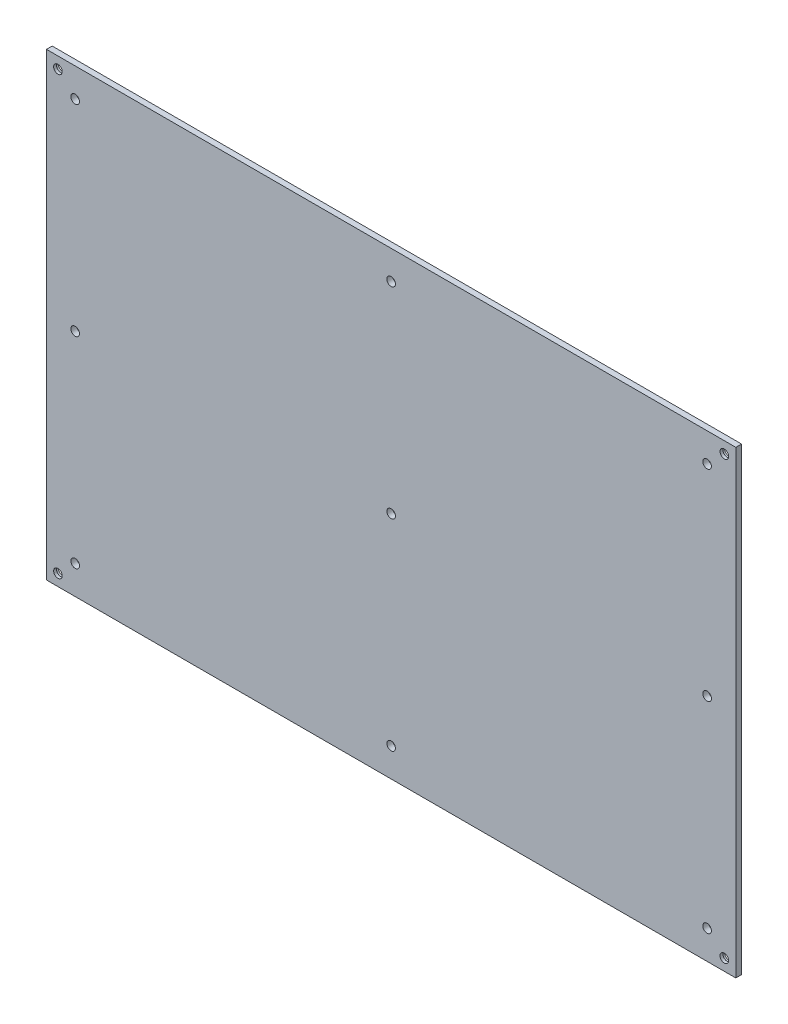
ISO-10303-21;
HEADER;
FILE_DESCRIPTION(('STEP AP214'),'2;1');
FILE_NAME('part.step','',(''),(''),'','','');
FILE_SCHEMA(('AUTOMOTIVE_DESIGN { 1 0 10303 214 1 1 1 1 }'));
ENDSEC;
DATA;
#1=APPLICATION_CONTEXT('core data for automotive mechanical design processes');
#2=APPLICATION_PROTOCOL_DEFINITION('international standard','automotive_design',2000,#1);
#3=PRODUCT_CONTEXT('',#1,'mechanical');
#4=PRODUCT('Part','Part','',(#3));
#5=PRODUCT_RELATED_PRODUCT_CATEGORY('part','',(#4));
#6=PRODUCT_DEFINITION_FORMATION('','',#4);
#7=PRODUCT_DEFINITION_CONTEXT('part definition',#1,'design');
#8=PRODUCT_DEFINITION('design','',#6,#7);
#9=PRODUCT_DEFINITION_SHAPE('','',#8);
#10=(LENGTH_UNIT() NAMED_UNIT(*) SI_UNIT(.MILLI.,.METRE.));
#11=(NAMED_UNIT(*) PLANE_ANGLE_UNIT() SI_UNIT($,.RADIAN.));
#12=(NAMED_UNIT(*) SI_UNIT($,.STERADIAN.) SOLID_ANGLE_UNIT());
#13=UNCERTAINTY_MEASURE_WITH_UNIT(LENGTH_MEASURE(1.E-05),#10,'distance_accuracy_value','');
#14=(GEOMETRIC_REPRESENTATION_CONTEXT(3) GLOBAL_UNCERTAINTY_ASSIGNED_CONTEXT((#13)) GLOBAL_UNIT_ASSIGNED_CONTEXT((#10,
#11,#12)) REPRESENTATION_CONTEXT('',''));
#15=CARTESIAN_POINT('',(0.,0.,0.));
#16=DIRECTION('',(0.,0.,1.));
#17=DIRECTION('',(1.,0.,0.));
#18=AXIS2_PLACEMENT_3D('',#15,#16,#17);
#19=CARTESIAN_POINT('',(120.,80.,2.));
#20=DIRECTION('',(-1.,0.,0.));
#21=DIRECTION('',(0.,0.,1.));
#22=AXIS2_PLACEMENT_3D('',#19,#20,#21);
#23=PLANE('',#22);
#24=DIRECTION('',(0.,1.,0.));
#25=VECTOR('',#24,1.);
#26=CARTESIAN_POINT('',(120.,80.,0.));
#27=LINE('',#26,#25);
#28=CARTESIAN_POINT('',(120.,-80.,0.));
#29=VERTEX_POINT('',#28);
#30=CARTESIAN_POINT('',(120.,80.,0.));
#31=VERTEX_POINT('',#30);
#32=EDGE_CURVE('E105',#29,#31,#27,.T.);
#33=ORIENTED_EDGE('',*,*,#32,.T.);
#34=DIRECTION('',(0.,0.,-1.));
#35=VECTOR('',#34,1.);
#36=CARTESIAN_POINT('',(120.,80.,2.));
#37=LINE('',#36,#35);
#38=CARTESIAN_POINT('',(120.,80.,2.));
#39=VERTEX_POINT('',#38);
#40=EDGE_CURVE('E11',#39,#31,#37,.T.);
#41=ORIENTED_EDGE('',*,*,#40,.F.);
#42=DIRECTION('',(0.,1.,0.));
#43=VECTOR('',#42,1.);
#44=CARTESIAN_POINT('',(120.,80.,2.));
#45=LINE('',#44,#43);
#46=CARTESIAN_POINT('',(120.,-80.,2.));
#47=VERTEX_POINT('',#46);
#48=EDGE_CURVE('E92',#47,#39,#45,.T.);
#49=ORIENTED_EDGE('',*,*,#48,.F.);
#50=DIRECTION('',(0.,0.,-1.));
#51=VECTOR('',#50,1.);
#52=CARTESIAN_POINT('',(120.,-80.,2.));
#53=LINE('',#52,#51);
#54=EDGE_CURVE('E101',#47,#29,#53,.T.);
#55=ORIENTED_EDGE('',*,*,#54,.T.);
#56=EDGE_LOOP('',(#33,#41,#49,#55));
#57=FACE_BOUND('',#56,.T.);
#58=ADVANCED_FACE('F39',(#57),#23,.F.);
#59=CARTESIAN_POINT('',(-120.,80.,2.));
#60=DIRECTION('',(0.,-1.,0.));
#61=DIRECTION('',(0.,0.,-1.));
#62=AXIS2_PLACEMENT_3D('',#59,#60,#61);
#63=PLANE('',#62);
#64=DIRECTION('',(-1.,0.,0.));
#65=VECTOR('',#64,1.);
#66=CARTESIAN_POINT('',(-120.,80.,0.));
#67=LINE('',#66,#65);
#68=CARTESIAN_POINT('',(-120.,80.,0.));
#69=VERTEX_POINT('',#68);
#70=EDGE_CURVE('E96',#31,#69,#67,.T.);
#71=ORIENTED_EDGE('',*,*,#70,.T.);
#72=DIRECTION('',(0.,0.,-1.));
#73=VECTOR('',#72,1.);
#74=CARTESIAN_POINT('',(-120.,80.,2.));
#75=LINE('',#74,#73);
#76=CARTESIAN_POINT('',(-120.,80.,2.));
#77=VERTEX_POINT('',#76);
#78=EDGE_CURVE('E48',#77,#69,#75,.T.);
#79=ORIENTED_EDGE('',*,*,#78,.F.);
#80=DIRECTION('',(-1.,0.,0.));
#81=VECTOR('',#80,1.);
#82=CARTESIAN_POINT('',(-120.,80.,2.));
#83=LINE('',#82,#81);
#84=EDGE_CURVE('E87',#39,#77,#83,.T.);
#85=ORIENTED_EDGE('',*,*,#84,.F.);
#86=ORIENTED_EDGE('',*,*,#40,.T.);
#87=EDGE_LOOP('',(#71,#79,#85,#86));
#88=FACE_BOUND('',#87,.T.);
#89=ADVANCED_FACE('F95',(#88),#63,.F.);
#90=CARTESIAN_POINT('',(-120.,80.,2.));
#91=DIRECTION('',(1.,0.,0.));
#92=DIRECTION('',(0.,1.,0.));
#93=AXIS2_PLACEMENT_3D('',#90,#91,#92);
#94=PLANE('',#93);
#95=DIRECTION('',(0.,-1.,0.));
#96=VECTOR('',#95,1.);
#97=CARTESIAN_POINT('',(-120.,80.,0.));
#98=LINE('',#97,#96);
#99=CARTESIAN_POINT('',(-120.,-80.,0.));
#100=VERTEX_POINT('',#99);
#101=EDGE_CURVE('E74',#69,#100,#98,.T.);
#102=ORIENTED_EDGE('',*,*,#101,.T.);
#103=DIRECTION('',(0.,0.,-1.));
#104=VECTOR('',#103,1.);
#105=CARTESIAN_POINT('',(-120.,-80.,2.));
#106=LINE('',#105,#104);
#107=CARTESIAN_POINT('',(-120.,-80.,2.));
#108=VERTEX_POINT('',#107);
#109=EDGE_CURVE('E97',#108,#100,#106,.T.);
#110=ORIENTED_EDGE('',*,*,#109,.F.);
#111=DIRECTION('',(0.,-1.,0.));
#112=VECTOR('',#111,1.);
#113=CARTESIAN_POINT('',(-120.,80.,2.));
#114=LINE('',#113,#112);
#115=EDGE_CURVE('E90',#77,#108,#114,.T.);
#116=ORIENTED_EDGE('',*,*,#115,.F.);
#117=ORIENTED_EDGE('',*,*,#78,.T.);
#118=EDGE_LOOP('',(#102,#110,#116,#117));
#119=FACE_BOUND('',#118,.T.);
#120=ADVANCED_FACE('F99',(#119),#94,.F.);
#121=CARTESIAN_POINT('',(-120.,-80.,2.));
#122=DIRECTION('',(0.,1.,0.));
#123=DIRECTION('',(0.,0.,1.));
#124=AXIS2_PLACEMENT_3D('',#121,#122,#123);
#125=PLANE('',#124);
#126=DIRECTION('',(1.,0.,0.));
#127=VECTOR('',#126,1.);
#128=CARTESIAN_POINT('',(-120.,-80.,0.));
#129=LINE('',#128,#127);
#130=EDGE_CURVE('E80',#100,#29,#129,.T.);
#131=ORIENTED_EDGE('',*,*,#130,.T.);
#132=ORIENTED_EDGE('',*,*,#54,.F.);
#133=DIRECTION('',(1.,0.,0.));
#134=VECTOR('',#133,1.);
#135=CARTESIAN_POINT('',(-120.,-80.,2.));
#136=LINE('',#135,#134);
#137=EDGE_CURVE('E57',#108,#47,#136,.T.);
#138=ORIENTED_EDGE('',*,*,#137,.F.);
#139=ORIENTED_EDGE('',*,*,#109,.T.);
#140=EDGE_LOOP('',(#131,#132,#138,#139));
#141=FACE_BOUND('',#140,.T.);
#142=ADVANCED_FACE('F179',(#141),#125,.F.);
#143=CARTESIAN_POINT('',(0.,0.,2.));
#144=DIRECTION('',(0.,0.,1.));
#145=DIRECTION('',(1.,0.,0.));
#146=AXIS2_PLACEMENT_3D('',#143,#144,#145);
#147=PLANE('',#146);
#148=CARTESIAN_POINT('',(116.,-76.,2.));
#149=DIRECTION('',(0.,0.,-1.));
#150=DIRECTION('',(1.,0.,0.));
#151=AXIS2_PLACEMENT_3D('',#148,#149,#150);
#152=CIRCLE('',#151,1.5);
#153=CARTESIAN_POINT('',(117.5,-76.,2.));
#154=VERTEX_POINT('',#153);
#155=EDGE_CURVE('E385',#154,#154,#152,.T.);
#156=ORIENTED_EDGE('',*,*,#155,.T.);
#157=EDGE_LOOP('',(#156));
#158=FACE_BOUND('',#157,.T.);
#159=CARTESIAN_POINT('',(116.,76.,2.));
#160=DIRECTION('',(0.,0.,-1.));
#161=DIRECTION('',(-1.,0.,0.));
#162=AXIS2_PLACEMENT_3D('',#159,#160,#161);
#163=CIRCLE('',#162,1.5);
#164=CARTESIAN_POINT('',(114.5,76.,2.));
#165=VERTEX_POINT('',#164);
#166=EDGE_CURVE('E389',#165,#165,#163,.T.);
#167=ORIENTED_EDGE('',*,*,#166,.T.);
#168=EDGE_LOOP('',(#167));
#169=FACE_BOUND('',#168,.T.);
#170=CARTESIAN_POINT('',(-116.,76.,2.));
#171=DIRECTION('',(0.,0.,-1.));
#172=DIRECTION('',(1.,0.,0.));
#173=AXIS2_PLACEMENT_3D('',#170,#171,#172);
#174=CIRCLE('',#173,1.5);
#175=CARTESIAN_POINT('',(-114.5,76.,2.));
#176=VERTEX_POINT('',#175);
#177=EDGE_CURVE('E512',#176,#176,#174,.T.);
#178=ORIENTED_EDGE('',*,*,#177,.T.);
#179=EDGE_LOOP('',(#178));
#180=FACE_BOUND('',#179,.T.);
#181=CARTESIAN_POINT('',(-116.,-76.,2.));
#182=DIRECTION('',(0.,0.,-1.));
#183=DIRECTION('',(-1.,0.,0.));
#184=AXIS2_PLACEMENT_3D('',#181,#182,#183);
#185=CIRCLE('',#184,1.5);
#186=CARTESIAN_POINT('',(-117.5,-76.,2.));
#187=VERTEX_POINT('',#186);
#188=EDGE_CURVE('E397',#187,#187,#185,.T.);
#189=ORIENTED_EDGE('',*,*,#188,.T.);
#190=EDGE_LOOP('',(#189));
#191=FACE_BOUND('',#190,.T.);
#192=CARTESIAN_POINT('',(0.,70.,2.));
#193=DIRECTION('',(0.,0.,1.));
#194=DIRECTION('',(1.,0.,0.));
#195=AXIS2_PLACEMENT_3D('',#192,#193,#194);
#196=CIRCLE('',#195,1.5);
#197=CARTESIAN_POINT('',(1.50000000000001,70.,2.));
#198=VERTEX_POINT('',#197);
#199=EDGE_CURVE('E441',#198,#198,#196,.T.);
#200=ORIENTED_EDGE('',*,*,#199,.F.);
#201=EDGE_LOOP('',(#200));
#202=FACE_BOUND('',#201,.T.);
#203=CARTESIAN_POINT('',(110.,70.,2.));
#204=DIRECTION('',(0.,0.,1.));
#205=DIRECTION('',(1.,0.,0.));
#206=AXIS2_PLACEMENT_3D('',#203,#204,#205);
#207=CIRCLE('',#206,1.5);
#208=CARTESIAN_POINT('',(111.5,70.,2.));
#209=VERTEX_POINT('',#208);
#210=EDGE_CURVE('E443',#209,#209,#207,.T.);
#211=ORIENTED_EDGE('',*,*,#210,.F.);
#212=EDGE_LOOP('',(#211));
#213=FACE_BOUND('',#212,.T.);
#214=CARTESIAN_POINT('',(7.49400541621981E-13,0.,2.));
#215=DIRECTION('',(0.,0.,1.));
#216=DIRECTION('',(1.,0.,0.));
#217=AXIS2_PLACEMENT_3D('',#214,#215,#216);
#218=CIRCLE('',#217,1.5);
#219=CARTESIAN_POINT('',(1.50000000000075,0.,2.));
#220=VERTEX_POINT('',#219);
#221=EDGE_CURVE('E446',#220,#220,#218,.T.);
#222=ORIENTED_EDGE('',*,*,#221,.F.);
#223=EDGE_LOOP('',(#222));
#224=FACE_BOUND('',#223,.T.);
#225=CARTESIAN_POINT('',(110.000000000001,0.,2.));
#226=DIRECTION('',(0.,0.,1.));
#227=DIRECTION('',(1.,0.,0.));
#228=AXIS2_PLACEMENT_3D('',#225,#226,#227);
#229=CIRCLE('',#228,1.5);
#230=CARTESIAN_POINT('',(111.500000000001,0.,2.));
#231=VERTEX_POINT('',#230);
#232=EDGE_CURVE('E432',#231,#231,#229,.T.);
#233=ORIENTED_EDGE('',*,*,#232,.F.);
#234=EDGE_LOOP('',(#233));
#235=FACE_BOUND('',#234,.T.);
#236=CARTESIAN_POINT('',(1.47104550762833E-12,-70.,2.));
#237=DIRECTION('',(0.,0.,1.));
#238=DIRECTION('',(1.,0.,0.));
#239=AXIS2_PLACEMENT_3D('',#236,#237,#238);
#240=CIRCLE('',#239,1.5);
#241=CARTESIAN_POINT('',(1.50000000000147,-70.,2.));
#242=VERTEX_POINT('',#241);
#243=EDGE_CURVE('E429',#242,#242,#240,.T.);
#244=ORIENTED_EDGE('',*,*,#243,.F.);
#245=EDGE_LOOP('',(#244));
#246=FACE_BOUND('',#245,.T.);
#247=CARTESIAN_POINT('',(110.000000000001,-70.,2.));
#248=DIRECTION('',(0.,0.,1.));
#249=DIRECTION('',(1.,0.,0.));
#250=AXIS2_PLACEMENT_3D('',#247,#248,#249);
#251=CIRCLE('',#250,1.5);
#252=CARTESIAN_POINT('',(111.500000000001,-70.,2.));
#253=VERTEX_POINT('',#252);
#254=EDGE_CURVE('E433',#253,#253,#251,.T.);
#255=ORIENTED_EDGE('',*,*,#254,.F.);
#256=EDGE_LOOP('',(#255));
#257=FACE_BOUND('',#256,.T.);
#258=CARTESIAN_POINT('',(-109.999999999999,0.,2.));
#259=DIRECTION('',(0.,0.,1.));
#260=DIRECTION('',(1.,0.,0.));
#261=AXIS2_PLACEMENT_3D('',#258,#259,#260);
#262=CIRCLE('',#261,1.5);
#263=CARTESIAN_POINT('',(-108.499999999999,0.,2.));
#264=VERTEX_POINT('',#263);
#265=EDGE_CURVE('E436',#264,#264,#262,.T.);
#266=ORIENTED_EDGE('',*,*,#265,.F.);
#267=EDGE_LOOP('',(#266));
#268=FACE_BOUND('',#267,.T.);
#269=CARTESIAN_POINT('',(-109.999999999999,-70.,2.));
#270=DIRECTION('',(0.,0.,1.));
#271=DIRECTION('',(1.,0.,0.));
#272=AXIS2_PLACEMENT_3D('',#269,#270,#271);
#273=CIRCLE('',#272,1.5);
#274=CARTESIAN_POINT('',(-108.499999999999,-70.,2.));
#275=VERTEX_POINT('',#274);
#276=EDGE_CURVE('E426',#275,#275,#273,.T.);
#277=ORIENTED_EDGE('',*,*,#276,.F.);
#278=EDGE_LOOP('',(#277));
#279=FACE_BOUND('',#278,.T.);
#280=CARTESIAN_POINT('',(-110.,70.,2.));
#281=DIRECTION('',(0.,0.,1.));
#282=DIRECTION('',(1.,0.,0.));
#283=AXIS2_PLACEMENT_3D('',#280,#281,#282);
#284=CIRCLE('',#283,1.5);
#285=CARTESIAN_POINT('',(-108.5,70.,2.));
#286=VERTEX_POINT('',#285);
#287=EDGE_CURVE('E117',#286,#286,#284,.T.);
#288=ORIENTED_EDGE('',*,*,#287,.F.);
#289=EDGE_LOOP('',(#288));
#290=FACE_BOUND('',#289,.T.);
#291=ORIENTED_EDGE('',*,*,#48,.T.);
#292=ORIENTED_EDGE('',*,*,#84,.T.);
#293=ORIENTED_EDGE('',*,*,#115,.T.);
#294=ORIENTED_EDGE('',*,*,#137,.T.);
#295=EDGE_LOOP('',(#291,#292,#293,#294));
#296=FACE_BOUND('',#295,.T.);
#297=ADVANCED_FACE('F88',(#158,#169,#180,#191,#202,#213,#224,#235,#246,#257,#268,#279,#290,
#296),#147,.T.);
#298=CARTESIAN_POINT('',(0.,0.,0.));
#299=DIRECTION('',(0.,0.,1.));
#300=DIRECTION('',(1.,0.,0.));
#301=AXIS2_PLACEMENT_3D('',#298,#299,#300);
#302=PLANE('',#301);
#303=CARTESIAN_POINT('',(116.000000000002,-75.9999999999999,0.));
#304=DIRECTION('',(0.,0.,-1.));
#305=DIRECTION('',(1.,0.,0.));
#306=AXIS2_PLACEMENT_3D('',#303,#304,#305);
#307=CIRCLE('',#306,2.);
#308=CARTESIAN_POINT('',(118.000000000002,-75.9999999999999,0.));
#309=VERTEX_POINT('',#308);
#310=EDGE_CURVE('E418',#309,#309,#307,.T.);
#311=ORIENTED_EDGE('',*,*,#310,.F.);
#312=EDGE_LOOP('',(#311));
#313=FACE_BOUND('',#312,.T.);
#314=CARTESIAN_POINT('',(116.000000000001,75.9999999999999,0.));
#315=DIRECTION('',(0.,0.,-1.));
#316=DIRECTION('',(-1.,0.,0.));
#317=AXIS2_PLACEMENT_3D('',#314,#315,#316);
#318=CIRCLE('',#317,2.);
#319=CARTESIAN_POINT('',(114.000000000001,75.9999999999999,0.));
#320=VERTEX_POINT('',#319);
#321=EDGE_CURVE('E412',#320,#320,#318,.T.);
#322=ORIENTED_EDGE('',*,*,#321,.F.);
#323=EDGE_LOOP('',(#322));
#324=FACE_BOUND('',#323,.T.);
#325=CARTESIAN_POINT('',(-116.,76.,0.));
#326=DIRECTION('',(0.,0.,-1.));
#327=DIRECTION('',(1.,0.,0.));
#328=AXIS2_PLACEMENT_3D('',#325,#326,#327);
#329=CIRCLE('',#328,2.);
#330=CARTESIAN_POINT('',(-114.,76.,0.));
#331=VERTEX_POINT('',#330);
#332=EDGE_CURVE('E405',#331,#331,#329,.T.);
#333=ORIENTED_EDGE('',*,*,#332,.F.);
#334=EDGE_LOOP('',(#333));
#335=FACE_BOUND('',#334,.T.);
#336=CARTESIAN_POINT('',(-116.,-76.,0.));
#337=DIRECTION('',(0.,0.,-1.));
#338=DIRECTION('',(-1.,0.,0.));
#339=AXIS2_PLACEMENT_3D('',#336,#337,#338);
#340=CIRCLE('',#339,2.);
#341=CARTESIAN_POINT('',(-118.,-76.,0.));
#342=VERTEX_POINT('',#341);
#343=EDGE_CURVE('E408',#342,#342,#340,.T.);
#344=ORIENTED_EDGE('',*,*,#343,.F.);
#345=EDGE_LOOP('',(#344));
#346=FACE_BOUND('',#345,.T.);
#347=CARTESIAN_POINT('',(0.,70.,0.));
#348=DIRECTION('',(0.,0.,1.));
#349=DIRECTION('',(1.,0.,0.));
#350=AXIS2_PLACEMENT_3D('',#347,#348,#349);
#351=CIRCLE('',#350,1.5);
#352=CARTESIAN_POINT('',(1.50000000000001,70.,0.));
#353=VERTEX_POINT('',#352);
#354=EDGE_CURVE('E42',#353,#353,#351,.T.);
#355=ORIENTED_EDGE('',*,*,#354,.T.);
#356=EDGE_LOOP('',(#355));
#357=FACE_BOUND('',#356,.T.);
#358=CARTESIAN_POINT('',(110.,70.,0.));
#359=DIRECTION('',(0.,0.,1.));
#360=DIRECTION('',(1.,0.,0.));
#361=AXIS2_PLACEMENT_3D('',#358,#359,#360);
#362=CIRCLE('',#361,1.5);
#363=CARTESIAN_POINT('',(111.5,70.,0.));
#364=VERTEX_POINT('',#363);
#365=EDGE_CURVE('E134',#364,#364,#362,.T.);
#366=ORIENTED_EDGE('',*,*,#365,.T.);
#367=EDGE_LOOP('',(#366));
#368=FACE_BOUND('',#367,.T.);
#369=CARTESIAN_POINT('',(7.49400541621981E-13,0.,0.));
#370=DIRECTION('',(0.,0.,1.));
#371=DIRECTION('',(1.,0.,0.));
#372=AXIS2_PLACEMENT_3D('',#369,#370,#371);
#373=CIRCLE('',#372,1.5);
#374=CARTESIAN_POINT('',(1.50000000000075,0.,0.));
#375=VERTEX_POINT('',#374);
#376=EDGE_CURVE('E132',#375,#375,#373,.T.);
#377=ORIENTED_EDGE('',*,*,#376,.T.);
#378=EDGE_LOOP('',(#377));
#379=FACE_BOUND('',#378,.T.);
#380=CARTESIAN_POINT('',(110.000000000001,0.,0.));
#381=DIRECTION('',(0.,0.,1.));
#382=DIRECTION('',(1.,0.,0.));
#383=AXIS2_PLACEMENT_3D('',#380,#381,#382);
#384=CIRCLE('',#383,1.5);
#385=CARTESIAN_POINT('',(111.500000000001,0.,0.));
#386=VERTEX_POINT('',#385);
#387=EDGE_CURVE('E129',#386,#386,#384,.T.);
#388=ORIENTED_EDGE('',*,*,#387,.T.);
#389=EDGE_LOOP('',(#388));
#390=FACE_BOUND('',#389,.T.);
#391=CARTESIAN_POINT('',(1.47104550762833E-12,-70.,0.));
#392=DIRECTION('',(0.,0.,1.));
#393=DIRECTION('',(1.,0.,0.));
#394=AXIS2_PLACEMENT_3D('',#391,#392,#393);
#395=CIRCLE('',#394,1.5);
#396=CARTESIAN_POINT('',(1.50000000000147,-70.,0.));
#397=VERTEX_POINT('',#396);
#398=EDGE_CURVE('E126',#397,#397,#395,.T.);
#399=ORIENTED_EDGE('',*,*,#398,.T.);
#400=EDGE_LOOP('',(#399));
#401=FACE_BOUND('',#400,.T.);
#402=CARTESIAN_POINT('',(110.000000000001,-70.,0.));
#403=DIRECTION('',(0.,0.,1.));
#404=DIRECTION('',(1.,0.,0.));
#405=AXIS2_PLACEMENT_3D('',#402,#403,#404);
#406=CIRCLE('',#405,1.5);
#407=CARTESIAN_POINT('',(111.500000000001,-70.,0.));
#408=VERTEX_POINT('',#407);
#409=EDGE_CURVE('E123',#408,#408,#406,.T.);
#410=ORIENTED_EDGE('',*,*,#409,.T.);
#411=EDGE_LOOP('',(#410));
#412=FACE_BOUND('',#411,.T.);
#413=CARTESIAN_POINT('',(-109.999999999999,0.,0.));
#414=DIRECTION('',(0.,0.,1.));
#415=DIRECTION('',(1.,0.,0.));
#416=AXIS2_PLACEMENT_3D('',#413,#414,#415);
#417=CIRCLE('',#416,1.5);
#418=CARTESIAN_POINT('',(-108.499999999999,0.,0.));
#419=VERTEX_POINT('',#418);
#420=EDGE_CURVE('E120',#419,#419,#417,.T.);
#421=ORIENTED_EDGE('',*,*,#420,.T.);
#422=EDGE_LOOP('',(#421));
#423=FACE_BOUND('',#422,.T.);
#424=CARTESIAN_POINT('',(-109.999999999999,-70.,0.));
#425=DIRECTION('',(0.,0.,1.));
#426=DIRECTION('',(1.,0.,0.));
#427=AXIS2_PLACEMENT_3D('',#424,#425,#426);
#428=CIRCLE('',#427,1.5);
#429=CARTESIAN_POINT('',(-108.499999999999,-70.,0.));
#430=VERTEX_POINT('',#429);
#431=EDGE_CURVE('E116',#430,#430,#428,.T.);
#432=ORIENTED_EDGE('',*,*,#431,.T.);
#433=EDGE_LOOP('',(#432));
#434=FACE_BOUND('',#433,.T.);
#435=CARTESIAN_POINT('',(-110.,70.,0.));
#436=DIRECTION('',(0.,0.,1.));
#437=DIRECTION('',(1.,0.,0.));
#438=AXIS2_PLACEMENT_3D('',#435,#436,#437);
#439=CIRCLE('',#438,1.5);
#440=CARTESIAN_POINT('',(-108.5,70.,0.));
#441=VERTEX_POINT('',#440);
#442=EDGE_CURVE('E113',#441,#441,#439,.T.);
#443=ORIENTED_EDGE('',*,*,#442,.T.);
#444=EDGE_LOOP('',(#443));
#445=FACE_BOUND('',#444,.T.);
#446=ORIENTED_EDGE('',*,*,#32,.F.);
#447=ORIENTED_EDGE('',*,*,#130,.F.);
#448=ORIENTED_EDGE('',*,*,#101,.F.);
#449=ORIENTED_EDGE('',*,*,#70,.F.);
#450=EDGE_LOOP('',(#446,#447,#448,#449));
#451=FACE_BOUND('',#450,.T.);
#452=ADVANCED_FACE('F141',(#313,#324,#335,#346,#357,#368,#379,#390,#401,#412,#423,#434,#445,
#451),#302,.F.);
#453=CARTESIAN_POINT('',(-110.,70.,-2.));
#454=DIRECTION('',(0.,0.,1.));
#455=DIRECTION('',(1.,0.,0.));
#456=AXIS2_PLACEMENT_3D('',#453,#454,#455);
#457=CYLINDRICAL_SURFACE('',#456,1.5);
#458=ORIENTED_EDGE('',*,*,#287,.T.);
#459=EDGE_LOOP('',(#458));
#460=FACE_BOUND('',#459,.T.);
#461=ORIENTED_EDGE('',*,*,#442,.F.);
#462=EDGE_LOOP('',(#461));
#463=FACE_BOUND('',#462,.T.);
#464=ADVANCED_FACE('F169',(#460,#463),#457,.F.);
#465=CARTESIAN_POINT('',(-109.999999999999,-70.,-2.));
#466=DIRECTION('',(0.,0.,1.));
#467=DIRECTION('',(1.,0.,0.));
#468=AXIS2_PLACEMENT_3D('',#465,#466,#467);
#469=CYLINDRICAL_SURFACE('',#468,1.5);
#470=ORIENTED_EDGE('',*,*,#276,.T.);
#471=EDGE_LOOP('',(#470));
#472=FACE_BOUND('',#471,.T.);
#473=ORIENTED_EDGE('',*,*,#431,.F.);
#474=EDGE_LOOP('',(#473));
#475=FACE_BOUND('',#474,.T.);
#476=ADVANCED_FACE('F175',(#472,#475),#469,.F.);
#477=CARTESIAN_POINT('',(-109.999999999999,0.,-2.));
#478=DIRECTION('',(0.,0.,1.));
#479=DIRECTION('',(1.,0.,0.));
#480=AXIS2_PLACEMENT_3D('',#477,#478,#479);
#481=CYLINDRICAL_SURFACE('',#480,1.5);
#482=ORIENTED_EDGE('',*,*,#265,.T.);
#483=EDGE_LOOP('',(#482));
#484=FACE_BOUND('',#483,.T.);
#485=ORIENTED_EDGE('',*,*,#420,.F.);
#486=EDGE_LOOP('',(#485));
#487=FACE_BOUND('',#486,.T.);
#488=ADVANCED_FACE('F210',(#484,#487),#481,.F.);
#489=CARTESIAN_POINT('',(110.000000000001,-70.,-2.));
#490=DIRECTION('',(0.,0.,1.));
#491=DIRECTION('',(1.,0.,0.));
#492=AXIS2_PLACEMENT_3D('',#489,#490,#491);
#493=CYLINDRICAL_SURFACE('',#492,1.5);
#494=ORIENTED_EDGE('',*,*,#254,.T.);
#495=EDGE_LOOP('',(#494));
#496=FACE_BOUND('',#495,.T.);
#497=ORIENTED_EDGE('',*,*,#409,.F.);
#498=EDGE_LOOP('',(#497));
#499=FACE_BOUND('',#498,.T.);
#500=ADVANCED_FACE('F218',(#496,#499),#493,.F.);
#501=CARTESIAN_POINT('',(1.47104550762833E-12,-70.,-2.));
#502=DIRECTION('',(0.,0.,1.));
#503=DIRECTION('',(1.,0.,0.));
#504=AXIS2_PLACEMENT_3D('',#501,#502,#503);
#505=CYLINDRICAL_SURFACE('',#504,1.5);
#506=ORIENTED_EDGE('',*,*,#243,.T.);
#507=EDGE_LOOP('',(#506));
#508=FACE_BOUND('',#507,.T.);
#509=ORIENTED_EDGE('',*,*,#398,.F.);
#510=EDGE_LOOP('',(#509));
#511=FACE_BOUND('',#510,.T.);
#512=ADVANCED_FACE('F227',(#508,#511),#505,.F.);
#513=CARTESIAN_POINT('',(110.000000000001,0.,-2.));
#514=DIRECTION('',(0.,0.,1.));
#515=DIRECTION('',(1.,0.,0.));
#516=AXIS2_PLACEMENT_3D('',#513,#514,#515);
#517=CYLINDRICAL_SURFACE('',#516,1.5);
#518=ORIENTED_EDGE('',*,*,#232,.T.);
#519=EDGE_LOOP('',(#518));
#520=FACE_BOUND('',#519,.T.);
#521=ORIENTED_EDGE('',*,*,#387,.F.);
#522=EDGE_LOOP('',(#521));
#523=FACE_BOUND('',#522,.T.);
#524=ADVANCED_FACE('F236',(#520,#523),#517,.F.);
#525=CARTESIAN_POINT('',(7.49400541621981E-13,0.,-2.));
#526=DIRECTION('',(0.,0.,1.));
#527=DIRECTION('',(1.,0.,0.));
#528=AXIS2_PLACEMENT_3D('',#525,#526,#527);
#529=CYLINDRICAL_SURFACE('',#528,1.5);
#530=ORIENTED_EDGE('',*,*,#221,.T.);
#531=EDGE_LOOP('',(#530));
#532=FACE_BOUND('',#531,.T.);
#533=ORIENTED_EDGE('',*,*,#376,.F.);
#534=EDGE_LOOP('',(#533));
#535=FACE_BOUND('',#534,.T.);
#536=ADVANCED_FACE('F157',(#532,#535),#529,.F.);
#537=CARTESIAN_POINT('',(110.,70.,-2.));
#538=DIRECTION('',(0.,0.,1.));
#539=DIRECTION('',(1.,0.,0.));
#540=AXIS2_PLACEMENT_3D('',#537,#538,#539);
#541=CYLINDRICAL_SURFACE('',#540,1.5);
#542=ORIENTED_EDGE('',*,*,#210,.T.);
#543=EDGE_LOOP('',(#542));
#544=FACE_BOUND('',#543,.T.);
#545=ORIENTED_EDGE('',*,*,#365,.F.);
#546=EDGE_LOOP('',(#545));
#547=FACE_BOUND('',#546,.T.);
#548=ADVANCED_FACE('F146',(#544,#547),#541,.F.);
#549=CARTESIAN_POINT('',(0.,70.,-2.));
#550=DIRECTION('',(0.,0.,1.));
#551=DIRECTION('',(1.,0.,0.));
#552=AXIS2_PLACEMENT_3D('',#549,#550,#551);
#553=CYLINDRICAL_SURFACE('',#552,1.5);
#554=ORIENTED_EDGE('',*,*,#199,.T.);
#555=EDGE_LOOP('',(#554));
#556=FACE_BOUND('',#555,.T.);
#557=ORIENTED_EDGE('',*,*,#354,.F.);
#558=EDGE_LOOP('',(#557));
#559=FACE_BOUND('',#558,.T.);
#560=ADVANCED_FACE('F143',(#556,#559),#553,.F.);
#561=CARTESIAN_POINT('',(-116.,-76.,1.));
#562=DIRECTION('',(0.,0.,-1.));
#563=DIRECTION('',(-1.,0.,0.));
#564=AXIS2_PLACEMENT_3D('',#561,#562,#563);
#565=CYLINDRICAL_SURFACE('',#564,2.);
#566=CARTESIAN_POINT('',(-116.,-76.,1.));
#567=DIRECTION('',(0.,0.,-1.));
#568=DIRECTION('',(-1.,0.,0.));
#569=AXIS2_PLACEMENT_3D('',#566,#567,#568);
#570=CIRCLE('',#569,2.);
#571=CARTESIAN_POINT('',(-118.,-76.,1.));
#572=VERTEX_POINT('',#571);
#573=EDGE_CURVE('E423',#572,#572,#570,.T.);
#574=ORIENTED_EDGE('',*,*,#573,.F.);
#575=EDGE_LOOP('',(#574));
#576=FACE_BOUND('',#575,.T.);
#577=ORIENTED_EDGE('',*,*,#343,.T.);
#578=EDGE_LOOP('',(#577));
#579=FACE_BOUND('',#578,.T.);
#580=ADVANCED_FACE('F145',(#576,#579),#565,.F.);
#581=CARTESIAN_POINT('',(-116.,-76.,1.));
#582=DIRECTION('',(0.,0.,-1.));
#583=DIRECTION('',(-1.,0.,0.));
#584=AXIS2_PLACEMENT_3D('',#581,#582,#583);
#585=PLANE('',#584);
#586=CARTESIAN_POINT('',(-116.,-76.,1.));
#587=DIRECTION('',(0.,0.,-1.));
#588=DIRECTION('',(-1.,0.,0.));
#589=AXIS2_PLACEMENT_3D('',#586,#587,#588);
#590=CIRCLE('',#589,1.5);
#591=CARTESIAN_POINT('',(-117.5,-76.,1.));
#592=VERTEX_POINT('',#591);
#593=EDGE_CURVE('E401',#592,#592,#590,.T.);
#594=ORIENTED_EDGE('',*,*,#593,.F.);
#595=EDGE_LOOP('',(#594));
#596=FACE_BOUND('',#595,.T.);
#597=ORIENTED_EDGE('',*,*,#573,.T.);
#598=EDGE_LOOP('',(#597));
#599=FACE_BOUND('',#598,.T.);
#600=ADVANCED_FACE('F154',(#596,#599),#585,.T.);
#601=CARTESIAN_POINT('',(-116.,76.,1.));
#602=DIRECTION('',(0.,0.,-1.));
#603=DIRECTION('',(-1.,0.,0.));
#604=AXIS2_PLACEMENT_3D('',#601,#602,#603);
#605=CYLINDRICAL_SURFACE('',#604,2.);
#606=CARTESIAN_POINT('',(-116.,76.,1.));
#607=DIRECTION('',(0.,0.,-1.));
#608=DIRECTION('',(1.,0.,0.));
#609=AXIS2_PLACEMENT_3D('',#606,#607,#608);
#610=CIRCLE('',#609,2.);
#611=CARTESIAN_POINT('',(-114.,76.,1.));
#612=VERTEX_POINT('',#611);
#613=EDGE_CURVE('E409',#612,#612,#610,.T.);
#614=ORIENTED_EDGE('',*,*,#613,.F.);
#615=EDGE_LOOP('',(#614));
#616=FACE_BOUND('',#615,.T.);
#617=ORIENTED_EDGE('',*,*,#332,.T.);
#618=EDGE_LOOP('',(#617));
#619=FACE_BOUND('',#618,.T.);
#620=ADVANCED_FACE('F280',(#616,#619),#605,.F.);
#621=CARTESIAN_POINT('',(-116.,76.,1.));
#622=DIRECTION('',(0.,0.,1.));
#623=DIRECTION('',(1.,0.,0.));
#624=AXIS2_PLACEMENT_3D('',#621,#622,#623);
#625=PLANE('',#624);
#626=CARTESIAN_POINT('',(-116.,76.,1.));
#627=DIRECTION('',(0.,0.,-1.));
#628=DIRECTION('',(1.,0.,0.));
#629=AXIS2_PLACEMENT_3D('',#626,#627,#628);
#630=CIRCLE('',#629,1.5);
#631=CARTESIAN_POINT('',(-114.5,76.,1.));
#632=VERTEX_POINT('',#631);
#633=EDGE_CURVE('E404',#632,#632,#630,.T.);
#634=ORIENTED_EDGE('',*,*,#633,.F.);
#635=EDGE_LOOP('',(#634));
#636=FACE_BOUND('',#635,.T.);
#637=ORIENTED_EDGE('',*,*,#613,.T.);
#638=EDGE_LOOP('',(#637));
#639=FACE_BOUND('',#638,.T.);
#640=ADVANCED_FACE('F290',(#636,#639),#625,.F.);
#641=CARTESIAN_POINT('',(116.000000000001,75.9999999999999,1.));
#642=DIRECTION('',(0.,0.,-1.));
#643=DIRECTION('',(-1.,0.,0.));
#644=AXIS2_PLACEMENT_3D('',#641,#642,#643);
#645=CYLINDRICAL_SURFACE('',#644,2.);
#646=CARTESIAN_POINT('',(116.000000000001,75.9999999999999,1.));
#647=DIRECTION('',(0.,0.,-1.));
#648=DIRECTION('',(-1.,0.,0.));
#649=AXIS2_PLACEMENT_3D('',#646,#647,#648);
#650=CIRCLE('',#649,2.);
#651=CARTESIAN_POINT('',(114.000000000001,75.9999999999999,1.));
#652=VERTEX_POINT('',#651);
#653=EDGE_CURVE('E415',#652,#652,#650,.T.);
#654=ORIENTED_EDGE('',*,*,#653,.F.);
#655=EDGE_LOOP('',(#654));
#656=FACE_BOUND('',#655,.T.);
#657=ORIENTED_EDGE('',*,*,#321,.T.);
#658=EDGE_LOOP('',(#657));
#659=FACE_BOUND('',#658,.T.);
#660=ADVANCED_FACE('F300',(#656,#659),#645,.F.);
#661=CARTESIAN_POINT('',(116.000000000001,75.9999999999999,1.));
#662=DIRECTION('',(0.,0.,-1.));
#663=DIRECTION('',(-1.,0.,0.));
#664=AXIS2_PLACEMENT_3D('',#661,#662,#663);
#665=PLANE('',#664);
#666=CARTESIAN_POINT('',(116.,76.,1.));
#667=DIRECTION('',(0.,0.,-1.));
#668=DIRECTION('',(-1.,0.,0.));
#669=AXIS2_PLACEMENT_3D('',#666,#667,#668);
#670=CIRCLE('',#669,1.5);
#671=CARTESIAN_POINT('',(114.5,76.,1.));
#672=VERTEX_POINT('',#671);
#673=EDGE_CURVE('E392',#672,#672,#670,.T.);
#674=ORIENTED_EDGE('',*,*,#673,.F.);
#675=EDGE_LOOP('',(#674));
#676=FACE_BOUND('',#675,.T.);
#677=ORIENTED_EDGE('',*,*,#653,.T.);
#678=EDGE_LOOP('',(#677));
#679=FACE_BOUND('',#678,.T.);
#680=ADVANCED_FACE('F310',(#676,#679),#665,.T.);
#681=CARTESIAN_POINT('',(116.000000000002,-75.9999999999999,1.));
#682=DIRECTION('',(0.,0.,-1.));
#683=DIRECTION('',(-1.,0.,0.));
#684=AXIS2_PLACEMENT_3D('',#681,#682,#683);
#685=CYLINDRICAL_SURFACE('',#684,2.);
#686=CARTESIAN_POINT('',(116.000000000002,-75.9999999999999,1.));
#687=DIRECTION('',(0.,0.,-1.));
#688=DIRECTION('',(1.,0.,0.));
#689=AXIS2_PLACEMENT_3D('',#686,#687,#688);
#690=CIRCLE('',#689,2.);
#691=CARTESIAN_POINT('',(118.000000000002,-75.9999999999999,1.));
#692=VERTEX_POINT('',#691);
#693=EDGE_CURVE('E400',#692,#692,#690,.T.);
#694=ORIENTED_EDGE('',*,*,#693,.F.);
#695=EDGE_LOOP('',(#694));
#696=FACE_BOUND('',#695,.T.);
#697=ORIENTED_EDGE('',*,*,#310,.T.);
#698=EDGE_LOOP('',(#697));
#699=FACE_BOUND('',#698,.T.);
#700=ADVANCED_FACE('F320',(#696,#699),#685,.F.);
#701=CARTESIAN_POINT('',(116.000000000002,-75.9999999999999,1.));
#702=DIRECTION('',(0.,0.,1.));
#703=DIRECTION('',(1.,0.,0.));
#704=AXIS2_PLACEMENT_3D('',#701,#702,#703);
#705=PLANE('',#704);
#706=CARTESIAN_POINT('',(116.,-76.,1.));
#707=DIRECTION('',(0.,0.,-1.));
#708=DIRECTION('',(1.,0.,0.));
#709=AXIS2_PLACEMENT_3D('',#706,#707,#708);
#710=CIRCLE('',#709,1.5);
#711=CARTESIAN_POINT('',(117.5,-76.,1.));
#712=VERTEX_POINT('',#711);
#713=EDGE_CURVE('E388',#712,#712,#710,.T.);
#714=ORIENTED_EDGE('',*,*,#713,.F.);
#715=EDGE_LOOP('',(#714));
#716=FACE_BOUND('',#715,.T.);
#717=ORIENTED_EDGE('',*,*,#693,.T.);
#718=EDGE_LOOP('',(#717));
#719=FACE_BOUND('',#718,.T.);
#720=ADVANCED_FACE('F330',(#716,#719),#705,.F.);
#721=CARTESIAN_POINT('',(-116.,-76.,2.));
#722=DIRECTION('',(0.,0.,-1.));
#723=DIRECTION('',(-1.,0.,0.));
#724=AXIS2_PLACEMENT_3D('',#721,#722,#723);
#725=CYLINDRICAL_SURFACE('',#724,1.5);
#726=ORIENTED_EDGE('',*,*,#188,.F.);
#727=EDGE_LOOP('',(#726));
#728=FACE_BOUND('',#727,.T.);
#729=ORIENTED_EDGE('',*,*,#593,.T.);
#730=EDGE_LOOP('',(#729));
#731=FACE_BOUND('',#730,.T.);
#732=ADVANCED_FACE('F339',(#728,#731),#725,.F.);
#733=CARTESIAN_POINT('',(-116.,76.,2.));
#734=DIRECTION('',(0.,0.,-1.));
#735=DIRECTION('',(-1.,0.,0.));
#736=AXIS2_PLACEMENT_3D('',#733,#734,#735);
#737=CYLINDRICAL_SURFACE('',#736,1.5);
#738=ORIENTED_EDGE('',*,*,#177,.F.);
#739=EDGE_LOOP('',(#738));
#740=FACE_BOUND('',#739,.T.);
#741=ORIENTED_EDGE('',*,*,#633,.T.);
#742=EDGE_LOOP('',(#741));
#743=FACE_BOUND('',#742,.T.);
#744=ADVANCED_FACE('F349',(#740,#743),#737,.F.);
#745=CARTESIAN_POINT('',(116.,76.,2.));
#746=DIRECTION('',(0.,0.,-1.));
#747=DIRECTION('',(-1.,0.,0.));
#748=AXIS2_PLACEMENT_3D('',#745,#746,#747);
#749=CYLINDRICAL_SURFACE('',#748,1.5);
#750=ORIENTED_EDGE('',*,*,#166,.F.);
#751=EDGE_LOOP('',(#750));
#752=FACE_BOUND('',#751,.T.);
#753=ORIENTED_EDGE('',*,*,#673,.T.);
#754=EDGE_LOOP('',(#753));
#755=FACE_BOUND('',#754,.T.);
#756=ADVANCED_FACE('F359',(#752,#755),#749,.F.);
#757=CARTESIAN_POINT('',(116.,-76.,2.));
#758=DIRECTION('',(0.,0.,-1.));
#759=DIRECTION('',(-1.,0.,0.));
#760=AXIS2_PLACEMENT_3D('',#757,#758,#759);
#761=CYLINDRICAL_SURFACE('',#760,1.5);
#762=ORIENTED_EDGE('',*,*,#155,.F.);
#763=EDGE_LOOP('',(#762));
#764=FACE_BOUND('',#763,.T.);
#765=ORIENTED_EDGE('',*,*,#713,.T.);
#766=EDGE_LOOP('',(#765));
#767=FACE_BOUND('',#766,.T.);
#768=ADVANCED_FACE('F369',(#764,#767),#761,.F.);
#769=CLOSED_SHELL('',(#58,#89,#120,#142,#297,#452,#464,#476,#488,#500,#512,#524,#536,#548,#560,
#580,#600,#620,#640,#660,#680,#700,#720,#732,#744,#756,#768));
#770=MANIFOLD_SOLID_BREP('B2',#769);
#771=ADVANCED_BREP_SHAPE_REPRESENTATION('',(#18,#770),#14);
#772=SHAPE_DEFINITION_REPRESENTATION(#9,#771);
ENDSEC;
END-ISO-10303-21;
